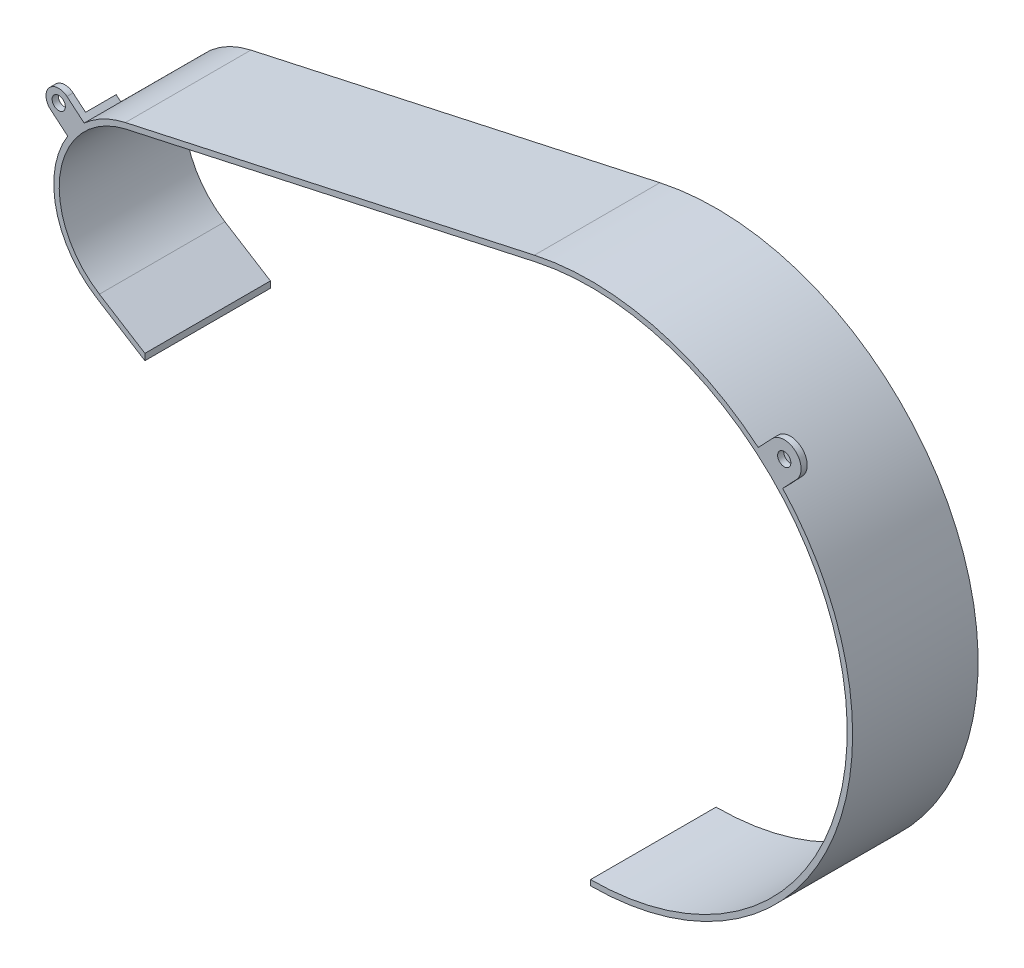
ISO-10303-21;
HEADER;
FILE_DESCRIPTION(('STEP AP214'),'2;1');
FILE_NAME('part.step','',(''),(''),'','','');
FILE_SCHEMA(('AUTOMOTIVE_DESIGN { 1 0 10303 214 1 1 1 1 }'));
ENDSEC;
DATA;
#1=APPLICATION_CONTEXT('core data for automotive mechanical design processes');
#2=APPLICATION_PROTOCOL_DEFINITION('international standard','automotive_design',2000,#1);
#3=PRODUCT_CONTEXT('',#1,'mechanical');
#4=PRODUCT('Part','Part','',(#3));
#5=PRODUCT_RELATED_PRODUCT_CATEGORY('part','',(#4));
#6=PRODUCT_DEFINITION_FORMATION('','',#4);
#7=PRODUCT_DEFINITION_CONTEXT('part definition',#1,'design');
#8=PRODUCT_DEFINITION('design','',#6,#7);
#9=PRODUCT_DEFINITION_SHAPE('','',#8);
#10=(LENGTH_UNIT() NAMED_UNIT(*) SI_UNIT(.MILLI.,.METRE.));
#11=(NAMED_UNIT(*) PLANE_ANGLE_UNIT() SI_UNIT($,.RADIAN.));
#12=(NAMED_UNIT(*) SI_UNIT($,.STERADIAN.) SOLID_ANGLE_UNIT());
#13=UNCERTAINTY_MEASURE_WITH_UNIT(LENGTH_MEASURE(1.E-05),#10,'distance_accuracy_value','');
#14=(GEOMETRIC_REPRESENTATION_CONTEXT(3) GLOBAL_UNCERTAINTY_ASSIGNED_CONTEXT((#13)) GLOBAL_UNIT_ASSIGNED_CONTEXT((#10,
#11,#12)) REPRESENTATION_CONTEXT('',''));
#15=CARTESIAN_POINT('',(0.,0.,0.));
#16=DIRECTION('',(0.,0.,1.));
#17=DIRECTION('',(1.,0.,0.));
#18=AXIS2_PLACEMENT_3D('',#15,#16,#17);
#19=CARTESIAN_POINT('',(-0.694427294768429,68.7178075815896,529.756425076619));
#20=DIRECTION('',(0.,0.,-1.));
#21=DIRECTION('',(-1.,0.,0.));
#22=AXIS2_PLACEMENT_3D('',#19,#20,#21);
#23=CYLINDRICAL_SURFACE('',#22,44.6599999999996);
#24=CARTESIAN_POINT('',(-0.694427294768429,68.7178075815896,43.5));
#25=DIRECTION('',(0.,0.,-1.));
#26=DIRECTION('',(-1.,0.,0.));
#27=AXIS2_PLACEMENT_3D('',#24,#25,#26);
#28=CIRCLE('',#27,44.6599999999996);
#29=CARTESIAN_POINT('',(-38.5377536434611,92.4327448757574,43.5));
#30=VERTEX_POINT('',#29);
#31=CARTESIAN_POINT('',(-30.4831205853251,101.991661461793,43.5));
#32=VERTEX_POINT('',#31);
#33=EDGE_CURVE('E11',#30,#32,#28,.T.);
#34=ORIENTED_EDGE('',*,*,#33,.T.);
#35=DIRECTION('',(0.,0.,1.));
#36=VECTOR('',#35,1.);
#37=CARTESIAN_POINT('',(-30.4831205853251,101.991661461793,58.5));
#38=LINE('',#37,#36);
#39=CARTESIAN_POINT('',(-30.4831205853251,101.991661461793,61.5));
#40=VERTEX_POINT('',#39);
#41=EDGE_CURVE('E255',#32,#40,#38,.T.);
#42=ORIENTED_EDGE('',*,*,#41,.T.);
#43=CARTESIAN_POINT('',(-0.694427294768429,68.7178075815896,61.5));
#44=DIRECTION('',(0.,0.,1.));
#45=DIRECTION('',(1.,0.,0.));
#46=AXIS2_PLACEMENT_3D('',#43,#44,#45);
#47=CIRCLE('',#46,44.6599999999996);
#48=CARTESIAN_POINT('',(-10.2551318055496,112.342439720527,61.5));
#49=VERTEX_POINT('',#48);
#50=EDGE_CURVE('E289',#49,#40,#47,.T.);
#51=ORIENTED_EDGE('',*,*,#50,.F.);
#52=DIRECTION('',(0.,0.,-1.));
#53=VECTOR('',#52,1.);
#54=CARTESIAN_POINT('',(-10.2551318055496,112.342439720527,529.756425076619));
#55=LINE('',#54,#53);
#56=CARTESIAN_POINT('',(-10.2551318055496,112.342439720527,0.));
#57=VERTEX_POINT('',#56);
#58=EDGE_CURVE('E330',#49,#57,#55,.T.);
#59=ORIENTED_EDGE('',*,*,#58,.T.);
#60=CARTESIAN_POINT('',(-0.694427294768429,68.7178075815896,0.));
#61=DIRECTION('',(0.,0.,1.));
#62=DIRECTION('',(1.,0.,0.));
#63=AXIS2_PLACEMENT_3D('',#60,#61,#62);
#64=CIRCLE('',#63,44.6599999999996);
#65=CARTESIAN_POINT('',(-24.4006211407413,30.8690034612858,0.));
#66=VERTEX_POINT('',#65);
#67=EDGE_CURVE('E322',#57,#66,#64,.T.);
#68=ORIENTED_EDGE('',*,*,#67,.T.);
#69=DIRECTION('',(0.,0.,-1.));
#70=VECTOR('',#69,1.);
#71=CARTESIAN_POINT('',(-24.4006211407413,30.8690034612858,529.756425076619));
#72=LINE('',#71,#70);
#73=CARTESIAN_POINT('',(-24.4006211407413,30.8690034612858,61.5));
#74=VERTEX_POINT('',#73);
#75=EDGE_CURVE('E328',#74,#66,#72,.T.);
#76=ORIENTED_EDGE('',*,*,#75,.F.);
#77=CARTESIAN_POINT('',(-38.5377536434611,92.4327448757574,61.5));
#78=VERTEX_POINT('',#77);
#79=EDGE_CURVE('E288',#78,#74,#47,.T.);
#80=ORIENTED_EDGE('',*,*,#79,.F.);
#81=DIRECTION('',(0.,0.,1.));
#82=VECTOR('',#81,1.);
#83=CARTESIAN_POINT('',(-38.5377536434611,92.4327448757574,58.5));
#84=LINE('',#83,#82);
#85=EDGE_CURVE('E258',#30,#78,#84,.T.);
#86=ORIENTED_EDGE('',*,*,#85,.F.);
#87=EDGE_LOOP('',(#34,#42,#51,#59,#68,#76,#80,#86));
#88=FACE_BOUND('',#87,.T.);
#89=ADVANCED_FACE('F37',(#88),#23,.T.);
#90=CARTESIAN_POINT('',(-42.9201771884048,104.298505240855,58.5));
#91=DIRECTION('',(0.,0.,-1.));
#92=DIRECTION('',(-1.,0.,0.));
#93=AXIS2_PLACEMENT_3D('',#90,#91,#92);
#94=PLANE('',#93);
#95=CARTESIAN_POINT('',(-42.9201771884048,104.298505240855,58.5));
#96=DIRECTION('',(0.,0.,1.));
#97=DIRECTION('',(1.,0.,0.));
#98=AXIS2_PLACEMENT_3D('',#95,#96,#97);
#99=CIRCLE('',#98,3.24999999999824);
#100=CARTESIAN_POINT('',(-39.6701771884066,104.298505240855,58.5));
#101=VERTEX_POINT('',#100);
#102=EDGE_CURVE('E230',#101,#101,#99,.T.);
#103=ORIENTED_EDGE('',*,*,#102,.T.);
#104=EDGE_LOOP('',(#103));
#105=FACE_BOUND('',#104,.T.);
#106=DIRECTION('',(-0.764713326882832,0.64437064465088,0.));
#107=VECTOR('',#106,1.);
#108=CARTESIAN_POINT('',(-38.8928606593368,109.077963533873,58.5));
#109=LINE('',#108,#107);
#110=CARTESIAN_POINT('',(-32.7772605659736,103.924773395745,58.5));
#111=VERTEX_POINT('',#110);
#112=CARTESIAN_POINT('',(-38.8928606593368,109.077963533873,58.5));
#113=VERTEX_POINT('',#112);
#114=EDGE_CURVE('E243',#111,#113,#109,.T.);
#115=ORIENTED_EDGE('',*,*,#114,.F.);
#116=DIRECTION('',(0.64437064465088,0.764713326882832,0.));
#117=VECTOR('',#116,1.);
#118=CARTESIAN_POINT('',(-32.7772605659736,103.924773395745,58.5));
#119=LINE('',#118,#117);
#120=CARTESIAN_POINT('',(-40.8318936241096,94.3658568097101,58.5));
#121=VERTEX_POINT('',#120);
#122=EDGE_CURVE('E212',#121,#111,#119,.T.);
#123=ORIENTED_EDGE('',*,*,#122,.F.);
#124=DIRECTION('',(0.76471332688283,-0.644370644650882,0.));
#125=VECTOR('',#124,1.);
#126=CARTESIAN_POINT('',(-46.9474937174728,99.5190469478378,58.5));
#127=LINE('',#126,#125);
#128=CARTESIAN_POINT('',(-46.9474937174728,99.5190469478378,58.5));
#129=VERTEX_POINT('',#128);
#130=EDGE_CURVE('E239',#129,#121,#127,.T.);
#131=ORIENTED_EDGE('',*,*,#130,.F.);
#132=CARTESIAN_POINT('',(-42.9201771884048,104.298505240855,58.5));
#133=DIRECTION('',(0.,0.,1.));
#134=DIRECTION('',(-1.,0.,0.));
#135=AXIS2_PLACEMENT_3D('',#132,#133,#134);
#136=CIRCLE('',#135,6.24999999999999);
#137=EDGE_CURVE('E236',#113,#129,#136,.T.);
#138=ORIENTED_EDGE('',*,*,#137,.F.);
#139=EDGE_LOOP('',(#115,#123,#131,#138));
#140=FACE_BOUND('',#139,.T.);
#141=ADVANCED_FACE('F392',(#105,#140),#94,.T.);
#142=CARTESIAN_POINT('',(-24.4006211407404,30.8690034612873,529.756425076619));
#143=DIRECTION('',(0.530814909224659,0.847487776988445,0.));
#144=DIRECTION('',(-0.847487776988445,0.530814909224659,0.));
#145=AXIS2_PLACEMENT_3D('',#142,#143,#144);
#146=PLANE('',#145);
#147=DIRECTION('',(0.,0.,-1.));
#148=VECTOR('',#147,1.);
#149=CARTESIAN_POINT('',(-0.694427294768426,16.0208823720042,529.756425076619));
#150=LINE('',#149,#148);
#151=CARTESIAN_POINT('',(-0.694427294768425,16.0208823720042,61.5));
#152=VERTEX_POINT('',#151);
#153=CARTESIAN_POINT('',(-0.694427294768425,16.0208823720042,0.));
#154=VERTEX_POINT('',#153);
#155=EDGE_CURVE('E275',#152,#154,#150,.T.);
#156=ORIENTED_EDGE('',*,*,#155,.F.);
#157=DIRECTION('',(0.847487776988445,-0.530814909224659,0.));
#158=VECTOR('',#157,1.);
#159=CARTESIAN_POINT('',(-24.4006211407404,30.8690034612873,61.5));
#160=LINE('',#159,#158);
#161=EDGE_CURVE('E285',#74,#152,#160,.T.);
#162=ORIENTED_EDGE('',*,*,#161,.F.);
#163=ORIENTED_EDGE('',*,*,#75,.T.);
#164=DIRECTION('',(0.847487776988445,-0.530814909224659,0.));
#165=VECTOR('',#164,1.);
#166=CARTESIAN_POINT('',(-24.4006211407404,30.8690034612873,0.));
#167=LINE('',#166,#165);
#168=EDGE_CURVE('E325',#66,#154,#167,.T.);
#169=ORIENTED_EDGE('',*,*,#168,.T.);
#170=EDGE_LOOP('',(#156,#162,#163,#169));
#171=FACE_BOUND('',#170,.T.);
#172=ADVANCED_FACE('F398',(#171),#146,.F.);
#173=CARTESIAN_POINT('',(217.691145537699,30.8015132248421,0.));
#174=DIRECTION('',(0.,0.,1.));
#175=DIRECTION('',(1.,0.,0.));
#176=AXIS2_PLACEMENT_3D('',#173,#174,#175);
#177=PLANE('',#176);
#178=DIRECTION('',(0.,1.,0.));
#179=VECTOR('',#178,1.);
#180=CARTESIAN_POINT('',(-0.694427294768425,0.,0.));
#181=LINE('',#180,#179);
#182=CARTESIAN_POINT('',(-0.694427294768423,19.1595707073715,0.));
#183=VERTEX_POINT('',#182);
#184=EDGE_CURVE('E262',#154,#183,#181,.T.);
#185=ORIENTED_EDGE('',*,*,#184,.F.);
#186=ORIENTED_EDGE('',*,*,#168,.F.);
#187=ORIENTED_EDGE('',*,*,#67,.F.);
#188=DIRECTION('',(-0.976816662313842,-0.21407757525263,0.));
#189=VECTOR('',#188,1.);
#190=CARTESIAN_POINT('',(190.193154586998,156.272365130291,0.));
#191=LINE('',#190,#189);
#192=CARTESIAN_POINT('',(190.193154586998,156.272365130291,0.));
#193=VERTEX_POINT('',#192);
#194=EDGE_CURVE('E319',#193,#57,#191,.T.);
#195=ORIENTED_EDGE('',*,*,#194,.F.);
#196=CARTESIAN_POINT('',(217.691145537699,30.8015132248421,0.));
#197=DIRECTION('',(0.,0.,1.));
#198=DIRECTION('',(1.,0.,0.));
#199=AXIS2_PLACEMENT_3D('',#196,#197,#198);
#200=CIRCLE('',#199,128.448722003);
#201=CARTESIAN_POINT('',(217.69114570248,-97.6472084391126,0.));
#202=VERTEX_POINT('',#201);
#203=EDGE_CURVE('E317',#202,#193,#200,.T.);
#204=ORIENTED_EDGE('',*,*,#203,.F.);
#205=DIRECTION('',(0.,1.,0.));
#206=VECTOR('',#205,1.);
#207=CARTESIAN_POINT('',(217.69114570248,0.,0.));
#208=LINE('',#207,#206);
#209=CARTESIAN_POINT('',(217.69114570248,-94.9872087781578,0.));
#210=VERTEX_POINT('',#209);
#211=EDGE_CURVE('E264',#202,#210,#208,.T.);
#212=ORIENTED_EDGE('',*,*,#211,.T.);
#213=CARTESIAN_POINT('',(217.691145537699,30.8015132248421,0.));
#214=DIRECTION('',(0.,0.,1.));
#215=DIRECTION('',(1.,0.,0.));
#216=AXIS2_PLACEMENT_3D('',#213,#214,#215);
#217=CIRCLE('',#216,125.788722003);
#218=CARTESIAN_POINT('',(190.76260093717,153.674032808536,0.));
#219=VERTEX_POINT('',#218);
#220=EDGE_CURVE('E305',#210,#219,#217,.T.);
#221=ORIENTED_EDGE('',*,*,#220,.T.);
#222=DIRECTION('',(-0.976816662313842,-0.21407757525263,0.));
#223=VECTOR('',#222,1.);
#224=CARTESIAN_POINT('',(190.76260093717,153.674032808536,0.));
#225=LINE('',#224,#223);
#226=CARTESIAN_POINT('',(-9.68568545537757,109.744107398773,0.));
#227=VERTEX_POINT('',#226);
#228=EDGE_CURVE('E307',#219,#227,#225,.T.);
#229=ORIENTED_EDGE('',*,*,#228,.T.);
#230=CARTESIAN_POINT('',(-0.694427294768429,68.7178075815896,0.));
#231=DIRECTION('',(0.,0.,1.));
#232=DIRECTION('',(1.,0.,0.));
#233=AXIS2_PLACEMENT_3D('',#230,#231,#232);
#234=CIRCLE('',#233,41.9999999999997);
#235=CARTESIAN_POINT('',(-22.9886534822028,33.1233209480766,0.));
#236=VERTEX_POINT('',#235);
#237=EDGE_CURVE('E299',#227,#236,#234,.T.);
#238=ORIENTED_EDGE('',*,*,#237,.T.);
#239=DIRECTION('',(0.847487776988445,-0.530814909224659,0.));
#240=VECTOR('',#239,1.);
#241=CARTESIAN_POINT('',(-22.9886534822028,33.1233209480766,0.));
#242=LINE('',#241,#240);
#243=EDGE_CURVE('E302',#236,#183,#242,.T.);
#244=ORIENTED_EDGE('',*,*,#243,.T.);
#245=EDGE_LOOP('',(#185,#186,#187,#195,#204,#212,#221,#229,#238,#244));
#246=FACE_BOUND('',#245,.T.);
#247=ADVANCED_FACE('F368',(#246),#177,.F.);
#248=CARTESIAN_POINT('',(-22.9886534822028,33.1233209480766,529.756425076619));
#249=DIRECTION('',(0.530814909224659,0.847487776988445,0.));
#250=DIRECTION('',(-0.847487776988445,0.530814909224659,0.));
#251=AXIS2_PLACEMENT_3D('',#248,#249,#250);
#252=PLANE('',#251);
#253=DIRECTION('',(0.847487776988445,-0.530814909224659,0.));
#254=VECTOR('',#253,1.);
#255=CARTESIAN_POINT('',(-22.9886534822028,33.1233209480766,61.5));
#256=LINE('',#255,#254);
#257=CARTESIAN_POINT('',(-22.9886534822028,33.1233209480766,61.5));
#258=VERTEX_POINT('',#257);
#259=CARTESIAN_POINT('',(-0.694427294768425,19.1595707073716,61.5));
#260=VERTEX_POINT('',#259);
#261=EDGE_CURVE('E279',#258,#260,#256,.T.);
#262=ORIENTED_EDGE('',*,*,#261,.T.);
#263=DIRECTION('',(0.,0.,-1.));
#264=VECTOR('',#263,1.);
#265=CARTESIAN_POINT('',(-0.694427294768426,19.1595707073716,529.756425076619));
#266=LINE('',#265,#264);
#267=EDGE_CURVE('E272',#260,#183,#266,.T.);
#268=ORIENTED_EDGE('',*,*,#267,.T.);
#269=ORIENTED_EDGE('',*,*,#243,.F.);
#270=DIRECTION('',(0.,0.,-1.));
#271=VECTOR('',#270,1.);
#272=CARTESIAN_POINT('',(-22.9886534822028,33.1233209480766,529.756425076619));
#273=LINE('',#272,#271);
#274=EDGE_CURVE('E315',#258,#236,#273,.T.);
#275=ORIENTED_EDGE('',*,*,#274,.F.);
#276=EDGE_LOOP('',(#262,#268,#269,#275));
#277=FACE_BOUND('',#276,.T.);
#278=ADVANCED_FACE('F345',(#277),#252,.T.);
#279=CARTESIAN_POINT('',(0.,0.,61.5));
#280=DIRECTION('',(0.,0.,1.));
#281=DIRECTION('',(1.,0.,0.));
#282=AXIS2_PLACEMENT_3D('',#279,#280,#281);
#283=PLANE('',#282);
#284=ORIENTED_EDGE('',*,*,#161,.T.);
#285=DIRECTION('',(0.,1.,0.));
#286=VECTOR('',#285,1.);
#287=CARTESIAN_POINT('',(-0.694427294768425,0.,61.5));
#288=LINE('',#287,#286);
#289=EDGE_CURVE('E45',#152,#260,#288,.T.);
#290=ORIENTED_EDGE('',*,*,#289,.T.);
#291=ORIENTED_EDGE('',*,*,#261,.F.);
#292=CARTESIAN_POINT('',(-0.694427294768429,68.7178075815896,61.5));
#293=DIRECTION('',(0.,0.,1.));
#294=DIRECTION('',(1.,0.,0.));
#295=AXIS2_PLACEMENT_3D('',#292,#293,#294);
#296=CIRCLE('',#295,41.9999999999997);
#297=CARTESIAN_POINT('',(-9.68568545537757,109.744107398773,61.5));
#298=VERTEX_POINT('',#297);
#299=EDGE_CURVE('E282',#298,#258,#296,.T.);
#300=ORIENTED_EDGE('',*,*,#299,.F.);
#301=DIRECTION('',(-0.976816662313842,-0.21407757525263,0.));
#302=VECTOR('',#301,1.);
#303=CARTESIAN_POINT('',(190.76260093717,153.674032808536,61.5));
#304=LINE('',#303,#302);
#305=CARTESIAN_POINT('',(190.76260093717,153.674032808536,61.5));
#306=VERTEX_POINT('',#305);
#307=EDGE_CURVE('E335',#306,#298,#304,.T.);
#308=ORIENTED_EDGE('',*,*,#307,.F.);
#309=CARTESIAN_POINT('',(217.691145537699,30.8015132248421,61.5));
#310=DIRECTION('',(0.,0.,1.));
#311=DIRECTION('',(1.,0.,0.));
#312=AXIS2_PLACEMENT_3D('',#309,#310,#311);
#313=CIRCLE('',#312,125.788722003);
#314=CARTESIAN_POINT('',(217.69114570248,-94.9872087781578,61.5));
#315=VERTEX_POINT('',#314);
#316=EDGE_CURVE('E277',#315,#306,#313,.T.);
#317=ORIENTED_EDGE('',*,*,#316,.F.);
#318=DIRECTION('',(0.,1.,0.));
#319=VECTOR('',#318,1.);
#320=CARTESIAN_POINT('',(217.69114570248,0.,61.5));
#321=LINE('',#320,#319);
#322=CARTESIAN_POINT('',(217.691145537699,-97.6472084391126,61.5));
#323=VERTEX_POINT('',#322);
#324=EDGE_CURVE('E254',#323,#315,#321,.T.);
#325=ORIENTED_EDGE('',*,*,#324,.F.);
#326=CARTESIAN_POINT('',(217.691145537699,30.8015132248421,61.5));
#327=DIRECTION('',(0.,0.,1.));
#328=DIRECTION('',(1.,0.,0.));
#329=AXIS2_PLACEMENT_3D('',#326,#327,#328);
#330=CIRCLE('',#329,128.448722003);
#331=CARTESIAN_POINT('',(311.872256471143,118.145617362136,61.5));
#332=VERTEX_POINT('',#331);
#333=EDGE_CURVE('E296',#323,#332,#330,.T.);
#334=ORIENTED_EDGE('',*,*,#333,.T.);
#335=DIRECTION('',(0.688031109296806,0.725681192149698,0.));
#336=VECTOR('',#335,1.);
#337=CARTESIAN_POINT('',(318.602174557112,125.243806548214,61.5));
#338=LINE('',#337,#336);
#339=CARTESIAN_POINT('',(318.602174557112,125.243806548214,61.5));
#340=VERTEX_POINT('',#339);
#341=EDGE_CURVE('E197',#332,#340,#338,.T.);
#342=ORIENTED_EDGE('',*,*,#341,.T.);
#343=CARTESIAN_POINT('',(312.61530472188,130.920063199914,61.5));
#344=DIRECTION('',(0.,0.,1.));
#345=DIRECTION('',(-1.,0.,0.));
#346=AXIS2_PLACEMENT_3D('',#343,#344,#345);
#347=CIRCLE('',#346,8.24999999999831);
#348=CARTESIAN_POINT('',(306.628434886649,136.596319851613,61.5));
#349=VERTEX_POINT('',#348);
#350=EDGE_CURVE('E207',#340,#349,#347,.T.);
#351=ORIENTED_EDGE('',*,*,#350,.T.);
#352=DIRECTION('',(-0.688031109297054,-0.725681192149463,0.));
#353=VECTOR('',#352,1.);
#354=CARTESIAN_POINT('',(306.628434886649,136.596319851613,61.5));
#355=LINE('',#354,#353);
#356=CARTESIAN_POINT('',(299.898516800677,129.498130665537,61.5));
#357=VERTEX_POINT('',#356);
#358=EDGE_CURVE('E52',#349,#357,#355,.T.);
#359=ORIENTED_EDGE('',*,*,#358,.T.);
#360=CARTESIAN_POINT('',(190.193154586998,156.272365130291,61.5));
#361=VERTEX_POINT('',#360);
#362=EDGE_CURVE('E295',#357,#361,#330,.T.);
#363=ORIENTED_EDGE('',*,*,#362,.T.);
#364=DIRECTION('',(-0.976816662313842,-0.21407757525263,0.));
#365=VECTOR('',#364,1.);
#366=CARTESIAN_POINT('',(190.193154586998,156.272365130291,61.5));
#367=LINE('',#366,#365);
#368=EDGE_CURVE('E292',#361,#49,#367,.T.);
#369=ORIENTED_EDGE('',*,*,#368,.T.);
#370=ORIENTED_EDGE('',*,*,#50,.T.);
#371=DIRECTION('',(-0.764713326882832,0.64437064465088,0.));
#372=VECTOR('',#371,1.);
#373=CARTESIAN_POINT('',(-38.8928606593368,109.077963533873,61.5));
#374=LINE('',#373,#372);
#375=CARTESIAN_POINT('',(-38.8928606593368,109.077963533873,61.5));
#376=VERTEX_POINT('',#375);
#377=EDGE_CURVE('E240',#40,#376,#374,.T.);
#378=ORIENTED_EDGE('',*,*,#377,.T.);
#379=CARTESIAN_POINT('',(-42.9201771884048,104.298505240855,61.5));
#380=DIRECTION('',(0.,0.,1.));
#381=DIRECTION('',(-1.,0.,0.));
#382=AXIS2_PLACEMENT_3D('',#379,#380,#381);
#383=CIRCLE('',#382,6.24999999999999);
#384=CARTESIAN_POINT('',(-46.9474937174728,99.5190469478378,61.5));
#385=VERTEX_POINT('',#384);
#386=EDGE_CURVE('E233',#376,#385,#383,.T.);
#387=ORIENTED_EDGE('',*,*,#386,.T.);
#388=DIRECTION('',(0.76471332688283,-0.644370644650882,0.));
#389=VECTOR('',#388,1.);
#390=CARTESIAN_POINT('',(-46.9474937174728,99.5190469478378,61.5));
#391=LINE('',#390,#389);
#392=EDGE_CURVE('E248',#385,#78,#391,.T.);
#393=ORIENTED_EDGE('',*,*,#392,.T.);
#394=ORIENTED_EDGE('',*,*,#79,.T.);
#395=EDGE_LOOP('',(#284,#290,#291,#300,#308,#317,#325,#334,#342,#351,#359,#363,#369,#370,#378,
#387,#393,#394));
#396=FACE_BOUND('',#395,.T.);
#397=CARTESIAN_POINT('',(-42.9201771884048,104.298505240855,61.5));
#398=DIRECTION('',(0.,0.,1.));
#399=DIRECTION('',(1.,0.,0.));
#400=AXIS2_PLACEMENT_3D('',#397,#398,#399);
#401=CIRCLE('',#400,3.24999999999824);
#402=CARTESIAN_POINT('',(-39.6701771884066,104.298505240855,61.5));
#403=VERTEX_POINT('',#402);
#404=EDGE_CURVE('E229',#403,#403,#401,.T.);
#405=ORIENTED_EDGE('',*,*,#404,.F.);
#406=EDGE_LOOP('',(#405));
#407=FACE_BOUND('',#406,.T.);
#408=CARTESIAN_POINT('',(312.61530472188,130.920063199914,61.5));
#409=DIRECTION('',(0.,0.,1.));
#410=DIRECTION('',(1.,0.,0.));
#411=AXIS2_PLACEMENT_3D('',#408,#409,#410);
#412=CIRCLE('',#411,3.2500000000008);
#413=CARTESIAN_POINT('',(315.865304721881,130.920063199914,61.5));
#414=VERTEX_POINT('',#413);
#415=EDGE_CURVE('E202',#414,#414,#412,.T.);
#416=ORIENTED_EDGE('',*,*,#415,.F.);
#417=EDGE_LOOP('',(#416));
#418=FACE_BOUND('',#417,.T.);
#419=ADVANCED_FACE('F338',(#396,#407,#418),#283,.T.);
#420=CARTESIAN_POINT('',(190.193154586998,156.272365130291,529.756425076619));
#421=DIRECTION('',(0.21407757525263,-0.976816662313842,0.));
#422=DIRECTION('',(0.976816662313842,0.21407757525263,0.));
#423=AXIS2_PLACEMENT_3D('',#420,#421,#422);
#424=PLANE('',#423);
#425=ORIENTED_EDGE('',*,*,#368,.F.);
#426=DIRECTION('',(0.,0.,-1.));
#427=VECTOR('',#426,1.);
#428=CARTESIAN_POINT('',(190.193154586998,156.272365130291,529.756425076619));
#429=LINE('',#428,#427);
#430=EDGE_CURVE('E332',#361,#193,#429,.T.);
#431=ORIENTED_EDGE('',*,*,#430,.T.);
#432=ORIENTED_EDGE('',*,*,#194,.T.);
#433=ORIENTED_EDGE('',*,*,#58,.F.);
#434=EDGE_LOOP('',(#425,#431,#432,#433));
#435=FACE_BOUND('',#434,.T.);
#436=ADVANCED_FACE('F377',(#435),#424,.F.);
#437=CARTESIAN_POINT('',(217.691145537699,30.8015132248421,529.756425076619));
#438=DIRECTION('',(0.,0.,-1.));
#439=DIRECTION('',(-1.,0.,0.));
#440=AXIS2_PLACEMENT_3D('',#437,#438,#439);
#441=CYLINDRICAL_SURFACE('',#440,128.448722003);
#442=CARTESIAN_POINT('',(217.691145537699,30.8015132248421,58.5));
#443=DIRECTION('',(0.,0.,-1.));
#444=DIRECTION('',(-1.,0.,0.));
#445=AXIS2_PLACEMENT_3D('',#442,#443,#444);
#446=CIRCLE('',#445,128.448722003);
#447=CARTESIAN_POINT('',(299.898516800677,129.498130665537,58.5));
#448=VERTEX_POINT('',#447);
#449=CARTESIAN_POINT('',(311.872256471143,118.145617362136,58.5));
#450=VERTEX_POINT('',#449);
#451=EDGE_CURVE('E193',#448,#450,#446,.T.);
#452=ORIENTED_EDGE('',*,*,#451,.T.);
#453=DIRECTION('',(0.,0.,1.));
#454=VECTOR('',#453,1.);
#455=CARTESIAN_POINT('',(311.872256471143,118.145617362136,58.5));
#456=LINE('',#455,#454);
#457=EDGE_CURVE('E213',#450,#332,#456,.T.);
#458=ORIENTED_EDGE('',*,*,#457,.T.);
#459=ORIENTED_EDGE('',*,*,#333,.F.);
#460=DIRECTION('',(0.,0.,1.));
#461=VECTOR('',#460,1.);
#462=CARTESIAN_POINT('',(217.69114570248,-97.6472084391126,0.));
#463=LINE('',#462,#461);
#464=EDGE_CURVE('E267',#202,#323,#463,.T.);
#465=ORIENTED_EDGE('',*,*,#464,.F.);
#466=ORIENTED_EDGE('',*,*,#203,.T.);
#467=ORIENTED_EDGE('',*,*,#430,.F.);
#468=ORIENTED_EDGE('',*,*,#362,.F.);
#469=DIRECTION('',(0.,0.,1.));
#470=VECTOR('',#469,1.);
#471=CARTESIAN_POINT('',(299.898516800677,129.498130665537,58.5));
#472=LINE('',#471,#470);
#473=EDGE_CURVE('E183',#448,#357,#472,.T.);
#474=ORIENTED_EDGE('',*,*,#473,.F.);
#475=EDGE_LOOP('',(#452,#458,#459,#465,#466,#467,#468,#474));
#476=FACE_BOUND('',#475,.T.);
#477=ADVANCED_FACE('F39',(#476),#441,.T.);
#478=CARTESIAN_POINT('',(190.76260093717,153.674032808536,529.756425076619));
#479=DIRECTION('',(0.21407757525263,-0.976816662313842,0.));
#480=DIRECTION('',(0.976816662313842,0.21407757525263,0.));
#481=AXIS2_PLACEMENT_3D('',#478,#479,#480);
#482=PLANE('',#481);
#483=DIRECTION('',(0.,0.,-1.));
#484=VECTOR('',#483,1.);
#485=CARTESIAN_POINT('',(190.76260093717,153.674032808536,529.756425076619));
#486=LINE('',#485,#484);
#487=EDGE_CURVE('E312',#306,#219,#486,.T.);
#488=ORIENTED_EDGE('',*,*,#487,.F.);
#489=ORIENTED_EDGE('',*,*,#307,.T.);
#490=DIRECTION('',(0.,0.,-1.));
#491=VECTOR('',#490,1.);
#492=CARTESIAN_POINT('',(-9.68568545537757,109.744107398773,529.756425076619));
#493=LINE('',#492,#491);
#494=EDGE_CURVE('E310',#298,#227,#493,.T.);
#495=ORIENTED_EDGE('',*,*,#494,.T.);
#496=ORIENTED_EDGE('',*,*,#228,.F.);
#497=EDGE_LOOP('',(#488,#489,#495,#496));
#498=FACE_BOUND('',#497,.T.);
#499=ADVANCED_FACE('F357',(#498),#482,.T.);
#500=CARTESIAN_POINT('',(217.691145537699,30.8015132248421,529.756425076619));
#501=DIRECTION('',(0.,0.,-1.));
#502=DIRECTION('',(-1.,0.,0.));
#503=AXIS2_PLACEMENT_3D('',#500,#501,#502);
#504=CYLINDRICAL_SURFACE('',#503,125.788722003);
#505=DIRECTION('',(0.,0.,-1.));
#506=VECTOR('',#505,1.);
#507=CARTESIAN_POINT('',(217.69114570248,-94.9872087781578,529.756425076619));
#508=LINE('',#507,#506);
#509=EDGE_CURVE('E270',#315,#210,#508,.T.);
#510=ORIENTED_EDGE('',*,*,#509,.F.);
#511=ORIENTED_EDGE('',*,*,#316,.T.);
#512=ORIENTED_EDGE('',*,*,#487,.T.);
#513=ORIENTED_EDGE('',*,*,#220,.F.);
#514=EDGE_LOOP('',(#510,#511,#512,#513));
#515=FACE_BOUND('',#514,.T.);
#516=ADVANCED_FACE('F361',(#515),#504,.F.);
#517=CARTESIAN_POINT('',(-0.694427294768429,68.7178075815896,529.756425076619));
#518=DIRECTION('',(0.,0.,-1.));
#519=DIRECTION('',(-1.,0.,0.));
#520=AXIS2_PLACEMENT_3D('',#517,#518,#519);
#521=CYLINDRICAL_SURFACE('',#520,41.9999999999997);
#522=ORIENTED_EDGE('',*,*,#494,.F.);
#523=ORIENTED_EDGE('',*,*,#299,.T.);
#524=ORIENTED_EDGE('',*,*,#274,.T.);
#525=ORIENTED_EDGE('',*,*,#237,.F.);
#526=EDGE_LOOP('',(#522,#523,#524,#525));
#527=FACE_BOUND('',#526,.T.);
#528=ADVANCED_FACE('F350',(#527),#521,.F.);
#529=CARTESIAN_POINT('',(217.69114570248,0.,0.));
#530=DIRECTION('',(1.,0.,0.));
#531=DIRECTION('',(0.,0.,-1.));
#532=AXIS2_PLACEMENT_3D('',#529,#530,#531);
#533=PLANE('',#532);
#534=ORIENTED_EDGE('',*,*,#509,.T.);
#535=ORIENTED_EDGE('',*,*,#211,.F.);
#536=ORIENTED_EDGE('',*,*,#464,.T.);
#537=ORIENTED_EDGE('',*,*,#324,.T.);
#538=EDGE_LOOP('',(#534,#535,#536,#537));
#539=FACE_BOUND('',#538,.T.);
#540=ADVANCED_FACE('F363',(#539),#533,.F.);
#541=CARTESIAN_POINT('',(-0.694427294768425,0.,0.));
#542=DIRECTION('',(1.,0.,0.));
#543=DIRECTION('',(0.,1.,0.));
#544=AXIS2_PLACEMENT_3D('',#541,#542,#543);
#545=PLANE('',#544);
#546=ORIENTED_EDGE('',*,*,#155,.T.);
#547=ORIENTED_EDGE('',*,*,#184,.T.);
#548=ORIENTED_EDGE('',*,*,#267,.F.);
#549=ORIENTED_EDGE('',*,*,#289,.F.);
#550=EDGE_LOOP('',(#546,#547,#548,#549));
#551=FACE_BOUND('',#550,.T.);
#552=ADVANCED_FACE('F415',(#551),#545,.T.);
#553=CARTESIAN_POINT('',(-42.9201771884048,104.298505240855,58.5));
#554=DIRECTION('',(0.,0.,1.));
#555=DIRECTION('',(1.,0.,0.));
#556=AXIS2_PLACEMENT_3D('',#553,#554,#555);
#557=CYLINDRICAL_SURFACE('',#556,6.24999999999999);
#558=ORIENTED_EDGE('',*,*,#386,.F.);
#559=DIRECTION('',(0.,0.,1.));
#560=VECTOR('',#559,1.);
#561=CARTESIAN_POINT('',(-38.8928606593368,109.077963533873,58.5));
#562=LINE('',#561,#560);
#563=EDGE_CURVE('E252',#113,#376,#562,.T.);
#564=ORIENTED_EDGE('',*,*,#563,.F.);
#565=ORIENTED_EDGE('',*,*,#137,.T.);
#566=DIRECTION('',(0.,0.,1.));
#567=VECTOR('',#566,1.);
#568=CARTESIAN_POINT('',(-46.9474937174728,99.5190469478378,58.5));
#569=LINE('',#568,#567);
#570=EDGE_CURVE('E245',#129,#385,#569,.T.);
#571=ORIENTED_EDGE('',*,*,#570,.T.);
#572=EDGE_LOOP('',(#558,#564,#565,#571));
#573=FACE_BOUND('',#572,.T.);
#574=ADVANCED_FACE('F447',(#573),#557,.T.);
#575=CARTESIAN_POINT('',(-38.8928606593368,109.077963533873,58.5));
#576=DIRECTION('',(0.64437064465088,0.764713326882832,0.));
#577=DIRECTION('',(-0.764713326882832,0.644370644650881,0.));
#578=AXIS2_PLACEMENT_3D('',#575,#576,#577);
#579=PLANE('',#578);
#580=ORIENTED_EDGE('',*,*,#377,.F.);
#581=ORIENTED_EDGE('',*,*,#41,.F.);
#582=DIRECTION('',(0.764713326882829,-0.644370644650884,0.));
#583=VECTOR('',#582,1.);
#584=CARTESIAN_POINT('',(-32.7772605659736,103.924773395745,43.5));
#585=LINE('',#584,#583);
#586=CARTESIAN_POINT('',(-32.7772605659736,103.924773395745,43.5));
#587=VERTEX_POINT('',#586);
#588=EDGE_CURVE('E217',#587,#32,#585,.T.);
#589=ORIENTED_EDGE('',*,*,#588,.F.);
#590=DIRECTION('',(0.,0.,1.));
#591=VECTOR('',#590,1.);
#592=CARTESIAN_POINT('',(-32.7772605659736,103.924773395745,43.5));
#593=LINE('',#592,#591);
#594=EDGE_CURVE('E224',#587,#111,#593,.T.);
#595=ORIENTED_EDGE('',*,*,#594,.T.);
#596=ORIENTED_EDGE('',*,*,#114,.T.);
#597=ORIENTED_EDGE('',*,*,#563,.T.);
#598=EDGE_LOOP('',(#580,#581,#589,#595,#596,#597));
#599=FACE_BOUND('',#598,.T.);
#600=ADVANCED_FACE('F435',(#599),#579,.T.);
#601=CARTESIAN_POINT('',(-46.9474937174728,99.5190469478378,58.5));
#602=DIRECTION('',(-0.644370644650882,-0.76471332688283,0.));
#603=DIRECTION('',(0.76471332688283,-0.644370644650882,0.));
#604=AXIS2_PLACEMENT_3D('',#601,#602,#603);
#605=PLANE('',#604);
#606=ORIENTED_EDGE('',*,*,#392,.F.);
#607=ORIENTED_EDGE('',*,*,#570,.F.);
#608=ORIENTED_EDGE('',*,*,#130,.T.);
#609=DIRECTION('',(0.,0.,1.));
#610=VECTOR('',#609,1.);
#611=CARTESIAN_POINT('',(-40.8318936241096,94.3658568097101,43.5));
#612=LINE('',#611,#610);
#613=CARTESIAN_POINT('',(-40.8318936241096,94.3658568097101,43.5));
#614=VERTEX_POINT('',#613);
#615=EDGE_CURVE('E60',#614,#121,#612,.T.);
#616=ORIENTED_EDGE('',*,*,#615,.F.);
#617=DIRECTION('',(-0.764713326882831,0.644370644650881,0.));
#618=VECTOR('',#617,1.);
#619=CARTESIAN_POINT('',(-38.5377536434611,92.4327448757574,43.5));
#620=LINE('',#619,#618);
#621=EDGE_CURVE('E220',#30,#614,#620,.T.);
#622=ORIENTED_EDGE('',*,*,#621,.F.);
#623=ORIENTED_EDGE('',*,*,#85,.T.);
#624=EDGE_LOOP('',(#606,#607,#608,#616,#622,#623));
#625=FACE_BOUND('',#624,.T.);
#626=ADVANCED_FACE('F450',(#625),#605,.T.);
#627=CARTESIAN_POINT('',(-42.9201771884048,104.298505240855,58.5));
#628=DIRECTION('',(0.,0.,1.));
#629=DIRECTION('',(1.,0.,0.));
#630=AXIS2_PLACEMENT_3D('',#627,#628,#629);
#631=CYLINDRICAL_SURFACE('',#630,3.24999999999824);
#632=ORIENTED_EDGE('',*,*,#102,.F.);
#633=EDGE_LOOP('',(#632));
#634=FACE_BOUND('',#633,.T.);
#635=ORIENTED_EDGE('',*,*,#404,.T.);
#636=EDGE_LOOP('',(#635));
#637=FACE_BOUND('',#636,.T.);
#638=ADVANCED_FACE('F452',(#634,#637),#631,.F.);
#639=CARTESIAN_POINT('',(-32.7772605659736,103.924773395745,43.5));
#640=DIRECTION('',(0.764713326882832,-0.64437064465088,0.));
#641=DIRECTION('',(0.64437064465088,0.764713326882832,0.));
#642=AXIS2_PLACEMENT_3D('',#639,#640,#641);
#643=PLANE('',#642);
#644=ORIENTED_EDGE('',*,*,#122,.T.);
#645=ORIENTED_EDGE('',*,*,#594,.F.);
#646=DIRECTION('',(0.64437064465088,0.764713326882832,0.));
#647=VECTOR('',#646,1.);
#648=CARTESIAN_POINT('',(-32.7772605659736,103.924773395745,43.5));
#649=LINE('',#648,#647);
#650=EDGE_CURVE('E222',#614,#587,#649,.T.);
#651=ORIENTED_EDGE('',*,*,#650,.F.);
#652=ORIENTED_EDGE('',*,*,#615,.T.);
#653=EDGE_LOOP('',(#644,#645,#651,#652));
#654=FACE_BOUND('',#653,.T.);
#655=ADVANCED_FACE('F439',(#654),#643,.F.);
#656=CARTESIAN_POINT('',(0.,0.,43.5));
#657=DIRECTION('',(0.,0.,-1.));
#658=DIRECTION('',(-1.,0.,0.));
#659=AXIS2_PLACEMENT_3D('',#656,#657,#658);
#660=PLANE('',#659);
#661=ORIENTED_EDGE('',*,*,#33,.F.);
#662=ORIENTED_EDGE('',*,*,#621,.T.);
#663=ORIENTED_EDGE('',*,*,#650,.T.);
#664=ORIENTED_EDGE('',*,*,#588,.T.);
#665=EDGE_LOOP('',(#661,#662,#663,#664));
#666=FACE_BOUND('',#665,.T.);
#667=ADVANCED_FACE('F388',(#666),#660,.T.);
#668=CARTESIAN_POINT('',(312.61530472188,130.920063199914,58.5));
#669=DIRECTION('',(0.,0.,1.));
#670=DIRECTION('',(1.,0.,0.));
#671=AXIS2_PLACEMENT_3D('',#668,#669,#670);
#672=CYLINDRICAL_SURFACE('',#671,8.24999999999831);
#673=ORIENTED_EDGE('',*,*,#350,.F.);
#674=DIRECTION('',(0.,0.,1.));
#675=VECTOR('',#674,1.);
#676=CARTESIAN_POINT('',(318.602174557112,125.243806548214,58.5));
#677=LINE('',#676,#675);
#678=CARTESIAN_POINT('',(318.602174557112,125.243806548214,58.5));
#679=VERTEX_POINT('',#678);
#680=EDGE_CURVE('E196',#679,#340,#677,.T.);
#681=ORIENTED_EDGE('',*,*,#680,.F.);
#682=CARTESIAN_POINT('',(312.61530472188,130.920063199914,58.5));
#683=DIRECTION('',(0.,0.,1.));
#684=DIRECTION('',(-1.,0.,0.));
#685=AXIS2_PLACEMENT_3D('',#682,#683,#684);
#686=CIRCLE('',#685,8.24999999999831);
#687=CARTESIAN_POINT('',(306.628434886649,136.596319851613,58.5));
#688=VERTEX_POINT('',#687);
#689=EDGE_CURVE('E190',#679,#688,#686,.T.);
#690=ORIENTED_EDGE('',*,*,#689,.T.);
#691=DIRECTION('',(0.,0.,1.));
#692=VECTOR('',#691,1.);
#693=CARTESIAN_POINT('',(306.628434886649,136.596319851613,58.5));
#694=LINE('',#693,#692);
#695=EDGE_CURVE('E175',#688,#349,#694,.T.);
#696=ORIENTED_EDGE('',*,*,#695,.T.);
#697=EDGE_LOOP('',(#673,#681,#690,#696));
#698=FACE_BOUND('',#697,.T.);
#699=ADVANCED_FACE('F195',(#698),#672,.T.);
#700=CARTESIAN_POINT('',(318.602174557112,125.243806548214,58.5));
#701=DIRECTION('',(0.725681192149698,-0.688031109296806,0.));
#702=DIRECTION('',(0.688031109296806,0.725681192149698,0.));
#703=AXIS2_PLACEMENT_3D('',#700,#701,#702);
#704=PLANE('',#703);
#705=ORIENTED_EDGE('',*,*,#341,.F.);
#706=ORIENTED_EDGE('',*,*,#457,.F.);
#707=DIRECTION('',(0.688031109296806,0.725681192149698,0.));
#708=VECTOR('',#707,1.);
#709=CARTESIAN_POINT('',(318.602174557112,125.243806548214,58.5));
#710=LINE('',#709,#708);
#711=EDGE_CURVE('E184',#450,#679,#710,.T.);
#712=ORIENTED_EDGE('',*,*,#711,.T.);
#713=ORIENTED_EDGE('',*,*,#680,.T.);
#714=EDGE_LOOP('',(#705,#706,#712,#713));
#715=FACE_BOUND('',#714,.T.);
#716=ADVANCED_FACE('F380',(#715),#704,.T.);
#717=CARTESIAN_POINT('',(306.628434886649,136.596319851613,58.5));
#718=DIRECTION('',(-0.725681192149463,0.688031109297054,0.));
#719=DIRECTION('',(-0.688031109297054,-0.725681192149463,0.));
#720=AXIS2_PLACEMENT_3D('',#717,#718,#719);
#721=PLANE('',#720);
#722=ORIENTED_EDGE('',*,*,#358,.F.);
#723=ORIENTED_EDGE('',*,*,#695,.F.);
#724=DIRECTION('',(-0.688031109297054,-0.725681192149463,0.));
#725=VECTOR('',#724,1.);
#726=CARTESIAN_POINT('',(306.628434886649,136.596319851613,58.5));
#727=LINE('',#726,#725);
#728=EDGE_CURVE('E178',#688,#448,#727,.T.);
#729=ORIENTED_EDGE('',*,*,#728,.T.);
#730=ORIENTED_EDGE('',*,*,#473,.T.);
#731=EDGE_LOOP('',(#722,#723,#729,#730));
#732=FACE_BOUND('',#731,.T.);
#733=ADVANCED_FACE('F177',(#732),#721,.T.);
#734=CARTESIAN_POINT('',(312.61530472188,130.920063199914,58.5));
#735=DIRECTION('',(0.,0.,-1.));
#736=DIRECTION('',(-1.,0.,0.));
#737=AXIS2_PLACEMENT_3D('',#734,#735,#736);
#738=PLANE('',#737);
#739=CARTESIAN_POINT('',(312.61530472188,130.920063199914,58.5));
#740=DIRECTION('',(0.,0.,1.));
#741=DIRECTION('',(1.,0.,0.));
#742=AXIS2_PLACEMENT_3D('',#739,#740,#741);
#743=CIRCLE('',#742,3.2500000000008);
#744=CARTESIAN_POINT('',(315.865304721881,130.920063199914,58.5));
#745=VERTEX_POINT('',#744);
#746=EDGE_CURVE('E209',#745,#745,#743,.T.);
#747=ORIENTED_EDGE('',*,*,#746,.T.);
#748=EDGE_LOOP('',(#747));
#749=FACE_BOUND('',#748,.T.);
#750=ORIENTED_EDGE('',*,*,#689,.F.);
#751=ORIENTED_EDGE('',*,*,#711,.F.);
#752=ORIENTED_EDGE('',*,*,#451,.F.);
#753=ORIENTED_EDGE('',*,*,#728,.F.);
#754=EDGE_LOOP('',(#750,#751,#752,#753));
#755=FACE_BOUND('',#754,.T.);
#756=ADVANCED_FACE('F188',(#749,#755),#738,.T.);
#757=CARTESIAN_POINT('',(312.61530472188,130.920063199914,58.5));
#758=DIRECTION('',(0.,0.,1.));
#759=DIRECTION('',(1.,0.,0.));
#760=AXIS2_PLACEMENT_3D('',#757,#758,#759);
#761=CYLINDRICAL_SURFACE('',#760,3.2500000000008);
#762=ORIENTED_EDGE('',*,*,#746,.F.);
#763=EDGE_LOOP('',(#762));
#764=FACE_BOUND('',#763,.T.);
#765=ORIENTED_EDGE('',*,*,#415,.T.);
#766=EDGE_LOOP('',(#765));
#767=FACE_BOUND('',#766,.T.);
#768=ADVANCED_FACE('F548',(#764,#767),#761,.F.);
#769=CLOSED_SHELL('',(#89,#141,#172,#247,#278,#419,#436,#477,#499,#516,#528,#540,#552,#574,#600,
#626,#638,#655,#667,#699,#716,#733,#756,#768));
#770=MANIFOLD_SOLID_BREP('B2',#769);
#771=ADVANCED_BREP_SHAPE_REPRESENTATION('',(#18,#770),#14);
#772=SHAPE_DEFINITION_REPRESENTATION(#9,#771);
ENDSEC;
END-ISO-10303-21;
